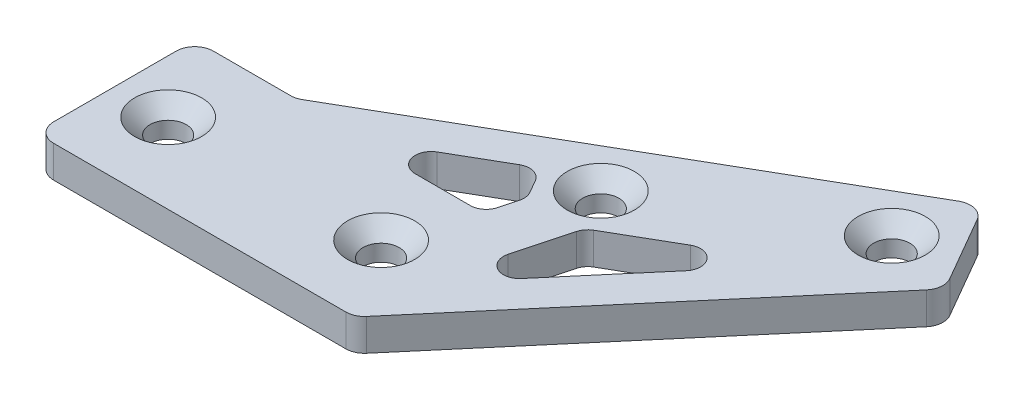
ISO-10303-21;
HEADER;
FILE_DESCRIPTION(('STEP AP214'),'2;1');
FILE_NAME('part.step','',(''),(''),'','','');
FILE_SCHEMA(('AUTOMOTIVE_DESIGN { 1 0 10303 214 1 1 1 1 }'));
ENDSEC;
DATA;
#1=APPLICATION_CONTEXT('core data for automotive mechanical design processes');
#2=APPLICATION_PROTOCOL_DEFINITION('international standard','automotive_design',2000,#1);
#3=PRODUCT_CONTEXT('',#1,'mechanical');
#4=PRODUCT('Part','Part','',(#3));
#5=PRODUCT_RELATED_PRODUCT_CATEGORY('part','',(#4));
#6=PRODUCT_DEFINITION_FORMATION('','',#4);
#7=PRODUCT_DEFINITION_CONTEXT('part definition',#1,'design');
#8=PRODUCT_DEFINITION('design','',#6,#7);
#9=PRODUCT_DEFINITION_SHAPE('','',#8);
#10=(LENGTH_UNIT() NAMED_UNIT(*) SI_UNIT(.MILLI.,.METRE.));
#11=(NAMED_UNIT(*) PLANE_ANGLE_UNIT() SI_UNIT($,.RADIAN.));
#12=(NAMED_UNIT(*) SI_UNIT($,.STERADIAN.) SOLID_ANGLE_UNIT());
#13=UNCERTAINTY_MEASURE_WITH_UNIT(LENGTH_MEASURE(1.E-05),#10,'distance_accuracy_value','');
#14=(GEOMETRIC_REPRESENTATION_CONTEXT(3) GLOBAL_UNCERTAINTY_ASSIGNED_CONTEXT((#13)) GLOBAL_UNIT_ASSIGNED_CONTEXT((#10,
#11,#12)) REPRESENTATION_CONTEXT('',''));
#15=CARTESIAN_POINT('',(0.,0.,0.));
#16=DIRECTION('',(0.,0.,1.));
#17=DIRECTION('',(1.,0.,0.));
#18=AXIS2_PLACEMENT_3D('',#15,#16,#17);
#19=CARTESIAN_POINT('',(0.,1.5,0.));
#20=DIRECTION('',(0.,-1.,0.));
#21=DIRECTION('',(0.,0.,-1.));
#22=AXIS2_PLACEMENT_3D('',#19,#20,#21);
#23=PLANE('',#22);
#24=CARTESIAN_POINT('',(5.,1.5,7.5));
#25=DIRECTION('',(0.,1.,0.));
#26=DIRECTION('',(0.,0.,1.));
#27=AXIS2_PLACEMENT_3D('',#24,#25,#26);
#28=CIRCLE('',#27,3.15);
#29=CARTESIAN_POINT('',(5.,1.5,10.65));
#30=VERTEX_POINT('',#29);
#31=EDGE_CURVE('E506',#30,#30,#28,.T.);
#32=ORIENTED_EDGE('',*,*,#31,.F.);
#33=EDGE_LOOP('',(#32));
#34=FACE_BOUND('',#33,.T.);
#35=CARTESIAN_POINT('',(25.,1.5,7.5));
#36=DIRECTION('',(0.,1.,0.));
#37=DIRECTION('',(0.,0.,1.));
#38=AXIS2_PLACEMENT_3D('',#35,#36,#37);
#39=CIRCLE('',#38,3.15);
#40=CARTESIAN_POINT('',(25.,1.5,10.65));
#41=VERTEX_POINT('',#40);
#42=EDGE_CURVE('E346',#41,#41,#39,.T.);
#43=ORIENTED_EDGE('',*,*,#42,.F.);
#44=EDGE_LOOP('',(#43));
#45=FACE_BOUND('',#44,.T.);
#46=CARTESIAN_POINT('',(31.3001270189222,1.5,-6.83012701892215));
#47=DIRECTION('',(0.,1.,0.));
#48=DIRECTION('',(0.,0.,1.));
#49=AXIS2_PLACEMENT_3D('',#46,#47,#48);
#50=CIRCLE('',#49,3.15);
#51=CARTESIAN_POINT('',(31.3001270189222,1.5,-3.68012701892215));
#52=VERTEX_POINT('',#51);
#53=EDGE_CURVE('E352',#52,#52,#50,.T.);
#54=ORIENTED_EDGE('',*,*,#53,.F.);
#55=EDGE_LOOP('',(#54));
#56=FACE_BOUND('',#55,.T.);
#57=CARTESIAN_POINT('',(48.620635094611,1.5,-16.8301270189222));
#58=DIRECTION('',(0.,1.,0.));
#59=DIRECTION('',(0.,0.,1.));
#60=AXIS2_PLACEMENT_3D('',#57,#58,#59);
#61=CIRCLE('',#60,3.15);
#62=CARTESIAN_POINT('',(48.620635094611,1.5,-13.6801270189222));
#63=VERTEX_POINT('',#62);
#64=EDGE_CURVE('E358',#63,#63,#61,.T.);
#65=ORIENTED_EDGE('',*,*,#64,.F.);
#66=EDGE_LOOP('',(#65));
#67=FACE_BOUND('',#66,.T.);
#68=DIRECTION('',(-0.258819045102521,0.,0.965925826289068));
#69=VECTOR('',#68,1.);
#70=CARTESIAN_POINT('',(30.6351432602032,1.5,8.20866189658321));
#71=LINE('',#70,#69);
#72=CARTESIAN_POINT('',(33.472623995892,1.5,-2.38096037450546));
#73=VERTEX_POINT('',#72);
#74=CARTESIAN_POINT('',(32.1164978136408,1.5,2.68017143913028));
#75=VERTEX_POINT('',#74);
#76=EDGE_CURVE('E293',#73,#75,#71,.T.);
#77=ORIENTED_EDGE('',*,*,#76,.F.);
#78=CARTESIAN_POINT('',(34.9215127353256,1.5,-1.99273180685168));
#79=DIRECTION('',(0.,-1.,0.));
#80=DIRECTION('',(0.,0.,-1.));
#81=AXIS2_PLACEMENT_3D('',#78,#79,#80);
#82=CIRCLE('',#81,1.5);
#83=CARTESIAN_POINT('',(34.1715127353256,1.5,-3.29176991252834));
#84=VERTEX_POINT('',#83);
#85=EDGE_CURVE('E295',#73,#84,#82,.T.);
#86=ORIENTED_EDGE('',*,*,#85,.T.);
#87=DIRECTION('',(0.866025403784438,0.,-0.500000000000001));
#88=VECTOR('',#87,1.);
#89=CARTESIAN_POINT('',(7.11750000000004,1.5,12.3278716228715));
#90=LINE('',#89,#88);
#91=CARTESIAN_POINT('',(39.9291176898745,1.5,-6.61592468292466));
#92=VERTEX_POINT('',#91);
#93=EDGE_CURVE('E289',#84,#92,#90,.T.);
#94=ORIENTED_EDGE('',*,*,#93,.T.);
#95=CARTESIAN_POINT('',(40.6791176898745,1.5,-5.31688657724799));
#96=DIRECTION('',(0.,-1.,0.));
#97=DIRECTION('',(0.,0.,-1.));
#98=AXIS2_PLACEMENT_3D('',#95,#96,#97);
#99=CIRCLE('',#98,1.5);
#100=CARTESIAN_POINT('',(41.8229525524503,1.5,-4.34650427776186));
#101=VERTEX_POINT('',#100);
#102=EDGE_CURVE('E285',#92,#101,#99,.T.);
#103=ORIENTED_EDGE('',*,*,#102,.T.);
#104=DIRECTION('',(0.646921532990766,0.,-0.762556575050584));
#105=VECTOR('',#104,1.);
#106=CARTESIAN_POINT('',(22.175541919768,1.5,18.8128147379565));
#107=LINE('',#106,#105);
#108=CARTESIAN_POINT('',(34.7092214156503,1.5,4.03878230627021));
#109=VERTEX_POINT('',#108);
#110=EDGE_CURVE('E302',#109,#101,#107,.T.);
#111=ORIENTED_EDGE('',*,*,#110,.F.);
#112=CARTESIAN_POINT('',(33.5653865530744,1.5,3.06840000678406));
#113=DIRECTION('',(0.,-1.,0.));
#114=DIRECTION('',(0.,0.,-1.));
#115=AXIS2_PLACEMENT_3D('',#112,#113,#114);
#116=CIRCLE('',#115,1.5);
#117=EDGE_CURVE('E227',#109,#75,#116,.T.);
#118=ORIENTED_EDGE('',*,*,#117,.T.);
#119=EDGE_LOOP('',(#77,#86,#94,#103,#111,#118));
#120=FACE_BOUND('',#119,.T.);
#121=DIRECTION('',(-1.,0.,0.));
#122=VECTOR('',#121,1.);
#123=CARTESIAN_POINT('',(0.,1.5,0.));
#124=LINE('',#123,#122);
#125=CARTESIAN_POINT('',(9.00108891324583,1.5,0.));
#126=VERTEX_POINT('',#125);
#127=CARTESIAN_POINT('',(1.75,1.5,0.));
#128=VERTEX_POINT('',#127);
#129=EDGE_CURVE('E478',#126,#128,#124,.T.);
#130=ORIENTED_EDGE('',*,*,#129,.T.);
#131=CARTESIAN_POINT('',(1.75,1.5,1.75));
#132=DIRECTION('',(0.,-1.,0.));
#133=DIRECTION('',(0.,0.,-1.));
#134=AXIS2_PLACEMENT_3D('',#131,#132,#133);
#135=CIRCLE('',#134,1.75);
#136=CARTESIAN_POINT('',(0.,1.5,1.75));
#137=VERTEX_POINT('',#136);
#138=EDGE_CURVE('E388',#128,#137,#135,.F.);
#139=ORIENTED_EDGE('',*,*,#138,.T.);
#140=DIRECTION('',(0.,0.,1.));
#141=VECTOR('',#140,1.);
#142=CARTESIAN_POINT('',(0.,1.5,15.));
#143=LINE('',#142,#141);
#144=CARTESIAN_POINT('',(0.,1.5,13.25));
#145=VERTEX_POINT('',#144);
#146=EDGE_CURVE('E474',#137,#145,#143,.T.);
#147=ORIENTED_EDGE('',*,*,#146,.T.);
#148=CARTESIAN_POINT('',(1.75,1.5,13.25));
#149=DIRECTION('',(0.,-1.,0.));
#150=DIRECTION('',(0.,0.,-1.));
#151=AXIS2_PLACEMENT_3D('',#148,#149,#150);
#152=CIRCLE('',#151,1.75);
#153=CARTESIAN_POINT('',(1.75000000000001,1.5,15.));
#154=VERTEX_POINT('',#153);
#155=EDGE_CURVE('E392',#145,#154,#152,.F.);
#156=ORIENTED_EDGE('',*,*,#155,.T.);
#157=DIRECTION('',(1.,0.,0.));
#158=VECTOR('',#157,1.);
#159=CARTESIAN_POINT('',(30.,1.5,15.));
#160=LINE('',#159,#158);
#161=CARTESIAN_POINT('',(29.1897160978185,1.5,15.));
#162=VERTEX_POINT('',#161);
#163=EDGE_CURVE('E470',#154,#162,#160,.T.);
#164=ORIENTED_EDGE('',*,*,#163,.T.);
#165=CARTESIAN_POINT('',(29.1897160978185,1.5,13.25));
#166=DIRECTION('',(0.,-1.,0.));
#167=DIRECTION('',(0.,0.,-1.));
#168=AXIS2_PLACEMENT_3D('',#165,#166,#167);
#169=CIRCLE('',#168,1.75);
#170=CARTESIAN_POINT('',(30.524190104157,1.5,14.3821126827338));
#171=VERTEX_POINT('',#170);
#172=EDGE_CURVE('E402',#162,#171,#169,.F.);
#173=ORIENTED_EDGE('',*,*,#172,.T.);
#174=DIRECTION('',(0.646921532990766,0.,-0.762556575050584));
#175=VECTOR('',#174,1.);
#176=CARTESIAN_POINT('',(55.4507621135331,1.5,-15.));
#177=LINE('',#176,#175);
#178=CARTESIAN_POINT('',(54.6534768491289,1.5,-14.0602026836986));
#179=VERTEX_POINT('',#178);
#180=EDGE_CURVE('E466',#171,#179,#177,.T.);
#181=ORIENTED_EDGE('',*,*,#180,.T.);
#182=CARTESIAN_POINT('',(53.3190028427904,1.5,-15.1923153664324));
#183=DIRECTION('',(0.,-1.,0.));
#184=DIRECTION('',(0.,0.,-1.));
#185=AXIS2_PLACEMENT_3D('',#182,#183,#184);
#186=CIRCLE('',#185,1.75);
#187=CARTESIAN_POINT('',(54.8345472994132,1.5,-16.0673153664324));
#188=VERTEX_POINT('',#187);
#189=EDGE_CURVE('E399',#179,#188,#186,.F.);
#190=ORIENTED_EDGE('',*,*,#189,.T.);
#191=DIRECTION('',(-0.500000000000002,0.,-0.866025403784437));
#192=VECTOR('',#191,1.);
#193=CARTESIAN_POINT('',(50.4507621135332,1.5,-23.6602540378443));
#194=LINE('',#193,#192);
#195=CARTESIAN_POINT('',(51.3257621135332,1.5,-22.1447095812216));
#196=VERTEX_POINT('',#195);
#197=EDGE_CURVE('E266',#188,#196,#194,.T.);
#198=ORIENTED_EDGE('',*,*,#197,.T.);
#199=CARTESIAN_POINT('',(49.8102176569104,1.5,-21.2697095812216));
#200=DIRECTION('',(0.,-1.,0.));
#201=DIRECTION('',(0.,0.,-1.));
#202=AXIS2_PLACEMENT_3D('',#199,#200,#201);
#203=CIRCLE('',#202,1.75);
#204=CARTESIAN_POINT('',(48.9352176569104,1.5,-22.7852540378443));
#205=VERTEX_POINT('',#204);
#206=EDGE_CURVE('E396',#196,#205,#203,.F.);
#207=ORIENTED_EDGE('',*,*,#206,.T.);
#208=DIRECTION('',(-0.866025403784437,0.,0.500000000000002));
#209=VECTOR('',#208,1.);
#210=CARTESIAN_POINT('',(24.47,1.5,-8.66025403784428));
#211=LINE('',#210,#209);
#212=CARTESIAN_POINT('',(9.87608891324584,1.5,-0.234455543377227));
#213=VERTEX_POINT('',#212);
#214=EDGE_CURVE('E450',#205,#213,#211,.T.);
#215=ORIENTED_EDGE('',*,*,#214,.T.);
#216=CARTESIAN_POINT('',(9.00108891324583,1.5,-1.75));
#217=DIRECTION('',(0.,-1.,0.));
#218=DIRECTION('',(0.,0.,-1.));
#219=AXIS2_PLACEMENT_3D('',#216,#217,#218);
#220=CIRCLE('',#219,1.75);
#221=EDGE_CURVE('E12',#213,#126,#220,.T.);
#222=ORIENTED_EDGE('',*,*,#221,.T.);
#223=EDGE_LOOP('',(#130,#139,#147,#156,#164,#173,#181,#190,#198,#207,#215,#222));
#224=FACE_BOUND('',#223,.T.);
#225=DIRECTION('',(0.500000000000001,0.,0.866025403784438));
#226=VECTOR('',#225,1.);
#227=CARTESIAN_POINT('',(22.5355127018922,1.5,-13.0108843247637));
#228=LINE('',#227,#226);
#229=CARTESIAN_POINT('',(27.4030127018923,1.5,-4.58012701892208));
#230=VERTEX_POINT('',#229);
#231=CARTESIAN_POINT('',(28.1049156630359,1.5,-3.36439542823822));
#232=VERTEX_POINT('',#231);
#233=EDGE_CURVE('E200',#230,#232,#228,.T.);
#234=ORIENTED_EDGE('',*,*,#233,.T.);
#235=CARTESIAN_POINT('',(26.8058775573593,1.5,-2.61439542823822));
#236=DIRECTION('',(0.,-1.,0.));
#237=DIRECTION('',(0.,0.,-1.));
#238=AXIS2_PLACEMENT_3D('',#235,#236,#237);
#239=CIRCLE('',#238,1.5);
#240=CARTESIAN_POINT('',(28.2547662967929,1.5,-2.22616686058444));
#241=VERTEX_POINT('',#240);
#242=EDGE_CURVE('E216',#232,#241,#239,.T.);
#243=ORIENTED_EDGE('',*,*,#242,.T.);
#244=DIRECTION('',(-0.258819045102522,0.,0.965925826289068));
#245=VECTOR('',#244,1.);
#246=CARTESIAN_POINT('',(25.8055141287578,1.5,6.91456667107061));
#247=LINE('',#246,#245);
#248=CARTESIAN_POINT('',(27.8221903455319,1.5,-0.611771432346216));
#249=VERTEX_POINT('',#248);
#250=EDGE_CURVE('E207',#241,#249,#247,.T.);
#251=ORIENTED_EDGE('',*,*,#250,.T.);
#252=CARTESIAN_POINT('',(26.3733016060983,1.5,-1.));
#253=DIRECTION('',(0.,-1.,0.));
#254=DIRECTION('',(0.,0.,-1.));
#255=AXIS2_PLACEMENT_3D('',#252,#253,#254);
#256=CIRCLE('',#255,1.5);
#257=CARTESIAN_POINT('',(26.3733016060983,1.5,0.5));
#258=VERTEX_POINT('',#257);
#259=EDGE_CURVE('E160',#249,#258,#256,.T.);
#260=ORIENTED_EDGE('',*,*,#259,.T.);
#261=DIRECTION('',(1.,0.,0.));
#262=VECTOR('',#261,1.);
#263=CARTESIAN_POINT('',(0.,1.5,0.5));
#264=LINE('',#263,#262);
#265=CARTESIAN_POINT('',(21.2020508075691,1.5,0.5));
#266=VERTEX_POINT('',#265);
#267=EDGE_CURVE('E54',#266,#258,#264,.T.);
#268=ORIENTED_EDGE('',*,*,#267,.F.);
#269=CARTESIAN_POINT('',(21.2020508075691,1.5,-1.));
#270=DIRECTION('',(0.,-1.,0.));
#271=DIRECTION('',(0.,0.,-1.));
#272=AXIS2_PLACEMENT_3D('',#269,#270,#271);
#273=CIRCLE('',#272,1.5);
#274=CARTESIAN_POINT('',(20.4520508075692,1.5,-2.29903810567666));
#275=VERTEX_POINT('',#274);
#276=EDGE_CURVE('E166',#266,#275,#273,.T.);
#277=ORIENTED_EDGE('',*,*,#276,.T.);
#278=DIRECTION('',(-0.866025403784438,0.,0.500000000000002));
#279=VECTOR('',#278,1.);
#280=CARTESIAN_POINT('',(4.1175000000001,1.5,7.13171920016499));
#281=LINE('',#280,#279);
#282=CARTESIAN_POINT('',(25.3539745962156,1.5,-5.12916512459875));
#283=VERTEX_POINT('',#282);
#284=EDGE_CURVE('E191',#283,#275,#281,.T.);
#285=ORIENTED_EDGE('',*,*,#284,.F.);
#286=CARTESIAN_POINT('',(26.1039745962156,1.5,-3.83012701892209));
#287=DIRECTION('',(0.,-1.,0.));
#288=DIRECTION('',(0.,0.,-1.));
#289=AXIS2_PLACEMENT_3D('',#286,#287,#288);
#290=CIRCLE('',#289,1.5);
#291=EDGE_CURVE('E211',#283,#230,#290,.T.);
#292=ORIENTED_EDGE('',*,*,#291,.T.);
#293=EDGE_LOOP('',(#234,#243,#251,#260,#268,#277,#285,#292));
#294=FACE_BOUND('',#293,.T.);
#295=ADVANCED_FACE('F50',(#34,#45,#56,#67,#120,#224,#294),#23,.F.);
#296=CARTESIAN_POINT('',(0.,-1.5,0.));
#297=DIRECTION('',(0.,-1.,0.));
#298=DIRECTION('',(0.,0.,-1.));
#299=AXIS2_PLACEMENT_3D('',#296,#297,#298);
#300=PLANE('',#299);
#301=CARTESIAN_POINT('',(5.,-1.5,7.5));
#302=DIRECTION('',(0.,-1.,0.));
#303=DIRECTION('',(0.,0.,-1.));
#304=AXIS2_PLACEMENT_3D('',#301,#302,#303);
#305=CIRCLE('',#304,1.7);
#306=CARTESIAN_POINT('',(5.,-1.5,5.8));
#307=VERTEX_POINT('',#306);
#308=EDGE_CURVE('E342',#307,#307,#305,.T.);
#309=ORIENTED_EDGE('',*,*,#308,.F.);
#310=EDGE_LOOP('',(#309));
#311=FACE_BOUND('',#310,.T.);
#312=CARTESIAN_POINT('',(25.,-1.5,7.5));
#313=DIRECTION('',(0.,-1.,0.));
#314=DIRECTION('',(0.,0.,-1.));
#315=AXIS2_PLACEMENT_3D('',#312,#313,#314);
#316=CIRCLE('',#315,1.7);
#317=CARTESIAN_POINT('',(25.,-1.5,5.8));
#318=VERTEX_POINT('',#317);
#319=EDGE_CURVE('E348',#318,#318,#316,.T.);
#320=ORIENTED_EDGE('',*,*,#319,.F.);
#321=EDGE_LOOP('',(#320));
#322=FACE_BOUND('',#321,.T.);
#323=CARTESIAN_POINT('',(31.3001270189222,-1.5,-6.83012701892215));
#324=DIRECTION('',(0.,-1.,0.));
#325=DIRECTION('',(0.,0.,-1.));
#326=AXIS2_PLACEMENT_3D('',#323,#324,#325);
#327=CIRCLE('',#326,1.7);
#328=CARTESIAN_POINT('',(31.3001270189222,-1.5,-8.53012701892214));
#329=VERTEX_POINT('',#328);
#330=EDGE_CURVE('E354',#329,#329,#327,.T.);
#331=ORIENTED_EDGE('',*,*,#330,.F.);
#332=EDGE_LOOP('',(#331));
#333=FACE_BOUND('',#332,.T.);
#334=CARTESIAN_POINT('',(48.620635094611,-1.5,-16.8301270189222));
#335=DIRECTION('',(0.,-1.,0.));
#336=DIRECTION('',(0.,0.,-1.));
#337=AXIS2_PLACEMENT_3D('',#334,#335,#336);
#338=CIRCLE('',#337,1.7);
#339=CARTESIAN_POINT('',(48.620635094611,-1.5,-18.5301270189222));
#340=VERTEX_POINT('',#339);
#341=EDGE_CURVE('E294',#340,#340,#338,.T.);
#342=ORIENTED_EDGE('',*,*,#341,.F.);
#343=EDGE_LOOP('',(#342));
#344=FACE_BOUND('',#343,.T.);
#345=DIRECTION('',(0.,0.,1.));
#346=VECTOR('',#345,1.);
#347=CARTESIAN_POINT('',(0.,-1.5,15.));
#348=LINE('',#347,#346);
#349=CARTESIAN_POINT('',(0.,-1.5,1.75));
#350=VERTEX_POINT('',#349);
#351=CARTESIAN_POINT('',(0.,-1.5,13.25));
#352=VERTEX_POINT('',#351);
#353=EDGE_CURVE('E457',#350,#352,#348,.T.);
#354=ORIENTED_EDGE('',*,*,#353,.F.);
#355=CARTESIAN_POINT('',(1.75,-1.5,1.75));
#356=DIRECTION('',(0.,-1.,0.));
#357=DIRECTION('',(0.,0.,-1.));
#358=AXIS2_PLACEMENT_3D('',#355,#356,#357);
#359=CIRCLE('',#358,1.75);
#360=CARTESIAN_POINT('',(1.75,-1.5,0.));
#361=VERTEX_POINT('',#360);
#362=EDGE_CURVE('E406',#350,#361,#359,.T.);
#363=ORIENTED_EDGE('',*,*,#362,.T.);
#364=DIRECTION('',(-1.,0.,0.));
#365=VECTOR('',#364,1.);
#366=CARTESIAN_POINT('',(0.,-1.5,0.));
#367=LINE('',#366,#365);
#368=CARTESIAN_POINT('',(9.00108891324583,-1.5,0.));
#369=VERTEX_POINT('',#368);
#370=EDGE_CURVE('E260',#369,#361,#367,.T.);
#371=ORIENTED_EDGE('',*,*,#370,.F.);
#372=CARTESIAN_POINT('',(9.00108891324583,-1.5,-1.75));
#373=DIRECTION('',(0.,-1.,0.));
#374=DIRECTION('',(0.,0.,-1.));
#375=AXIS2_PLACEMENT_3D('',#372,#373,#374);
#376=CIRCLE('',#375,1.75);
#377=CARTESIAN_POINT('',(9.87608891324584,-1.5,-0.234455543377237));
#378=VERTEX_POINT('',#377);
#379=EDGE_CURVE('E61',#369,#378,#376,.F.);
#380=ORIENTED_EDGE('',*,*,#379,.T.);
#381=DIRECTION('',(-0.866025403784438,0.,0.500000000000001));
#382=VECTOR('',#381,1.);
#383=CARTESIAN_POINT('',(24.47,-1.5,-8.66025403784428));
#384=LINE('',#383,#382);
#385=CARTESIAN_POINT('',(48.9352176569104,-1.5,-22.7852540378443));
#386=VERTEX_POINT('',#385);
#387=EDGE_CURVE('E252',#386,#378,#384,.T.);
#388=ORIENTED_EDGE('',*,*,#387,.F.);
#389=CARTESIAN_POINT('',(49.8102176569104,-1.5,-21.2697095812216));
#390=DIRECTION('',(0.,-1.,0.));
#391=DIRECTION('',(0.,0.,-1.));
#392=AXIS2_PLACEMENT_3D('',#389,#390,#391);
#393=CIRCLE('',#392,1.75);
#394=CARTESIAN_POINT('',(51.3257621135332,-1.5,-22.1447095812216));
#395=VERTEX_POINT('',#394);
#396=EDGE_CURVE('E413',#386,#395,#393,.T.);
#397=ORIENTED_EDGE('',*,*,#396,.T.);
#398=DIRECTION('',(-0.500000000000002,0.,-0.866025403784437));
#399=VECTOR('',#398,1.);
#400=CARTESIAN_POINT('',(50.4507621135332,-1.5,-23.6602540378443));
#401=LINE('',#400,#399);
#402=CARTESIAN_POINT('',(54.8345472994132,-1.5,-16.0673153664324));
#403=VERTEX_POINT('',#402);
#404=EDGE_CURVE('E447',#403,#395,#401,.T.);
#405=ORIENTED_EDGE('',*,*,#404,.F.);
#406=CARTESIAN_POINT('',(53.3190028427904,-1.5,-15.1923153664324));
#407=DIRECTION('',(0.,-1.,0.));
#408=DIRECTION('',(0.,0.,-1.));
#409=AXIS2_PLACEMENT_3D('',#406,#407,#408);
#410=CIRCLE('',#409,1.75);
#411=CARTESIAN_POINT('',(54.6534768491289,-1.5,-14.0602026836986));
#412=VERTEX_POINT('',#411);
#413=EDGE_CURVE('E417',#403,#412,#410,.T.);
#414=ORIENTED_EDGE('',*,*,#413,.T.);
#415=DIRECTION('',(0.646921532990766,0.,-0.762556575050584));
#416=VECTOR('',#415,1.);
#417=CARTESIAN_POINT('',(55.4507621135331,-1.5,-15.));
#418=LINE('',#417,#416);
#419=CARTESIAN_POINT('',(30.524190104157,-1.5,14.3821126827338));
#420=VERTEX_POINT('',#419);
#421=EDGE_CURVE('E451',#420,#412,#418,.T.);
#422=ORIENTED_EDGE('',*,*,#421,.F.);
#423=CARTESIAN_POINT('',(29.1897160978185,-1.5,13.25));
#424=DIRECTION('',(0.,-1.,0.));
#425=DIRECTION('',(0.,0.,-1.));
#426=AXIS2_PLACEMENT_3D('',#423,#424,#425);
#427=CIRCLE('',#426,1.75);
#428=CARTESIAN_POINT('',(29.1897160978185,-1.5,15.));
#429=VERTEX_POINT('',#428);
#430=EDGE_CURVE('E421',#420,#429,#427,.T.);
#431=ORIENTED_EDGE('',*,*,#430,.T.);
#432=DIRECTION('',(1.,0.,0.));
#433=VECTOR('',#432,1.);
#434=CARTESIAN_POINT('',(30.,-1.5,15.));
#435=LINE('',#434,#433);
#436=CARTESIAN_POINT('',(1.75000000000001,-1.5,15.));
#437=VERTEX_POINT('',#436);
#438=EDGE_CURVE('E454',#437,#429,#435,.T.);
#439=ORIENTED_EDGE('',*,*,#438,.F.);
#440=CARTESIAN_POINT('',(1.75,-1.5,13.25));
#441=DIRECTION('',(0.,-1.,0.));
#442=DIRECTION('',(0.,0.,-1.));
#443=AXIS2_PLACEMENT_3D('',#440,#441,#442);
#444=CIRCLE('',#443,1.75);
#445=EDGE_CURVE('E409',#437,#352,#444,.T.);
#446=ORIENTED_EDGE('',*,*,#445,.T.);
#447=EDGE_LOOP('',(#354,#363,#371,#380,#388,#397,#405,#414,#422,#431,#439,#446));
#448=FACE_BOUND('',#447,.T.);
#449=DIRECTION('',(-0.258819045102521,0.,0.965925826289068));
#450=VECTOR('',#449,1.);
#451=CARTESIAN_POINT('',(30.6351432602032,-1.5,8.20866189658321));
#452=LINE('',#451,#450);
#453=CARTESIAN_POINT('',(33.472623995892,-1.5,-2.38096037450546));
#454=VERTEX_POINT('',#453);
#455=CARTESIAN_POINT('',(32.1164978136408,-1.5,2.68017143913028));
#456=VERTEX_POINT('',#455);
#457=EDGE_CURVE('E311',#454,#456,#452,.T.);
#458=ORIENTED_EDGE('',*,*,#457,.T.);
#459=CARTESIAN_POINT('',(33.5653865530744,-1.5,3.06840000678406));
#460=DIRECTION('',(0.,-1.,0.));
#461=DIRECTION('',(0.,0.,-1.));
#462=AXIS2_PLACEMENT_3D('',#459,#460,#461);
#463=CIRCLE('',#462,1.5);
#464=CARTESIAN_POINT('',(34.7092214156503,-1.5,4.03878230627021));
#465=VERTEX_POINT('',#464);
#466=EDGE_CURVE('E298',#456,#465,#463,.F.);
#467=ORIENTED_EDGE('',*,*,#466,.T.);
#468=DIRECTION('',(0.646921532990766,0.,-0.762556575050584));
#469=VECTOR('',#468,1.);
#470=CARTESIAN_POINT('',(22.175541919768,-1.5,18.8128147379565));
#471=LINE('',#470,#469);
#472=CARTESIAN_POINT('',(41.8229525524503,-1.5,-4.34650427776186));
#473=VERTEX_POINT('',#472);
#474=EDGE_CURVE('E221',#465,#473,#471,.T.);
#475=ORIENTED_EDGE('',*,*,#474,.T.);
#476=CARTESIAN_POINT('',(40.6791176898745,-1.5,-5.31688657724799));
#477=DIRECTION('',(0.,-1.,0.));
#478=DIRECTION('',(0.,0.,-1.));
#479=AXIS2_PLACEMENT_3D('',#476,#477,#478);
#480=CIRCLE('',#479,1.5);
#481=CARTESIAN_POINT('',(39.9291176898745,-1.5,-6.61592468292466));
#482=VERTEX_POINT('',#481);
#483=EDGE_CURVE('E214',#473,#482,#480,.F.);
#484=ORIENTED_EDGE('',*,*,#483,.T.);
#485=DIRECTION('',(0.866025403784438,0.,-0.500000000000001));
#486=VECTOR('',#485,1.);
#487=CARTESIAN_POINT('',(7.11750000000004,-1.5,12.3278716228715));
#488=LINE('',#487,#486);
#489=CARTESIAN_POINT('',(34.1715127353256,-1.5,-3.29176991252834));
#490=VERTEX_POINT('',#489);
#491=EDGE_CURVE('E308',#490,#482,#488,.T.);
#492=ORIENTED_EDGE('',*,*,#491,.F.);
#493=CARTESIAN_POINT('',(34.9215127353256,-1.5,-1.99273180685168));
#494=DIRECTION('',(0.,-1.,0.));
#495=DIRECTION('',(0.,0.,-1.));
#496=AXIS2_PLACEMENT_3D('',#493,#494,#495);
#497=CIRCLE('',#496,1.5);
#498=EDGE_CURVE('E288',#490,#454,#497,.F.);
#499=ORIENTED_EDGE('',*,*,#498,.T.);
#500=EDGE_LOOP('',(#458,#467,#475,#484,#492,#499));
#501=FACE_BOUND('',#500,.T.);
#502=DIRECTION('',(-0.866025403784438,0.,0.500000000000002));
#503=VECTOR('',#502,1.);
#504=CARTESIAN_POINT('',(4.1175000000001,-1.5,7.13171920016499));
#505=LINE('',#504,#503);
#506=CARTESIAN_POINT('',(25.3539745962156,-1.5,-5.12916512459875));
#507=VERTEX_POINT('',#506);
#508=CARTESIAN_POINT('',(20.4520508075692,-1.5,-2.29903810567666));
#509=VERTEX_POINT('',#508);
#510=EDGE_CURVE('E242',#507,#509,#505,.T.);
#511=ORIENTED_EDGE('',*,*,#510,.T.);
#512=CARTESIAN_POINT('',(21.2020508075691,-1.5,-1.));
#513=DIRECTION('',(0.,-1.,0.));
#514=DIRECTION('',(0.,0.,-1.));
#515=AXIS2_PLACEMENT_3D('',#512,#513,#514);
#516=CIRCLE('',#515,1.5);
#517=CARTESIAN_POINT('',(21.2020508075691,-1.5,0.5));
#518=VERTEX_POINT('',#517);
#519=EDGE_CURVE('E175',#509,#518,#516,.F.);
#520=ORIENTED_EDGE('',*,*,#519,.T.);
#521=DIRECTION('',(1.,0.,0.));
#522=VECTOR('',#521,1.);
#523=CARTESIAN_POINT('',(0.,-1.5,0.5));
#524=LINE('',#523,#522);
#525=CARTESIAN_POINT('',(26.3733016060983,-1.5,0.5));
#526=VERTEX_POINT('',#525);
#527=EDGE_CURVE('E183',#518,#526,#524,.T.);
#528=ORIENTED_EDGE('',*,*,#527,.T.);
#529=CARTESIAN_POINT('',(26.3733016060983,-1.5,-1.));
#530=DIRECTION('',(0.,-1.,0.));
#531=DIRECTION('',(0.,0.,-1.));
#532=AXIS2_PLACEMENT_3D('',#529,#530,#531);
#533=CIRCLE('',#532,1.5);
#534=CARTESIAN_POINT('',(27.822190345532,-1.5,-0.611771432346216));
#535=VERTEX_POINT('',#534);
#536=EDGE_CURVE('E223',#526,#535,#533,.F.);
#537=ORIENTED_EDGE('',*,*,#536,.T.);
#538=DIRECTION('',(-0.258819045102522,0.,0.965925826289068));
#539=VECTOR('',#538,1.);
#540=CARTESIAN_POINT('',(25.8055141287578,-1.5,6.91456667107061));
#541=LINE('',#540,#539);
#542=CARTESIAN_POINT('',(28.2547662967929,-1.5,-2.22616686058444));
#543=VERTEX_POINT('',#542);
#544=EDGE_CURVE('E190',#543,#535,#541,.T.);
#545=ORIENTED_EDGE('',*,*,#544,.F.);
#546=CARTESIAN_POINT('',(26.8058775573593,-1.5,-2.61439542823822));
#547=DIRECTION('',(0.,-1.,0.));
#548=DIRECTION('',(0.,0.,-1.));
#549=AXIS2_PLACEMENT_3D('',#546,#547,#548);
#550=CIRCLE('',#549,1.5);
#551=CARTESIAN_POINT('',(28.1049156630359,-1.5,-3.36439542823822));
#552=VERTEX_POINT('',#551);
#553=EDGE_CURVE('E219',#543,#552,#550,.F.);
#554=ORIENTED_EDGE('',*,*,#553,.T.);
#555=DIRECTION('',(0.500000000000001,0.,0.866025403784438));
#556=VECTOR('',#555,1.);
#557=CARTESIAN_POINT('',(22.5355127018922,-1.5,-13.0108843247637));
#558=LINE('',#557,#556);
#559=CARTESIAN_POINT('',(27.4030127018923,-1.5,-4.58012701892208));
#560=VERTEX_POINT('',#559);
#561=EDGE_CURVE('E197',#560,#552,#558,.T.);
#562=ORIENTED_EDGE('',*,*,#561,.F.);
#563=CARTESIAN_POINT('',(26.1039745962156,-1.5,-3.83012701892209));
#564=DIRECTION('',(0.,-1.,0.));
#565=DIRECTION('',(0.,0.,-1.));
#566=AXIS2_PLACEMENT_3D('',#563,#564,#565);
#567=CIRCLE('',#566,1.5);
#568=EDGE_CURVE('E213',#560,#507,#567,.F.);
#569=ORIENTED_EDGE('',*,*,#568,.T.);
#570=EDGE_LOOP('',(#511,#520,#528,#537,#545,#554,#562,#569));
#571=FACE_BOUND('',#570,.T.);
#572=ADVANCED_FACE('F516',(#311,#322,#333,#344,#448,#501,#571),#300,.T.);
#573=CARTESIAN_POINT('',(24.47,1.5,-8.66025403784428));
#574=DIRECTION('',(0.500000000000002,0.,0.866025403784438));
#575=DIRECTION('',(0.866025403784438,0.,-0.500000000000002));
#576=AXIS2_PLACEMENT_3D('',#573,#574,#575);
#577=PLANE('',#576);
#578=ORIENTED_EDGE('',*,*,#387,.T.);
#579=DIRECTION('',(0.,-1.,0.));
#580=VECTOR('',#579,1.);
#581=CARTESIAN_POINT('',(9.87608891324584,1.5,-0.234455543377234));
#582=LINE('',#581,#580);
#583=EDGE_CURVE('E432',#378,#213,#582,.F.);
#584=ORIENTED_EDGE('',*,*,#583,.T.);
#585=ORIENTED_EDGE('',*,*,#214,.F.);
#586=DIRECTION('',(0.,-1.,0.));
#587=VECTOR('',#586,1.);
#588=CARTESIAN_POINT('',(48.9352176569104,1.5,-22.7852540378443));
#589=LINE('',#588,#587);
#590=EDGE_CURVE('E436',#205,#386,#589,.T.);
#591=ORIENTED_EDGE('',*,*,#590,.T.);
#592=EDGE_LOOP('',(#578,#584,#585,#591));
#593=FACE_BOUND('',#592,.T.);
#594=ADVANCED_FACE('F611',(#593),#577,.F.);
#595=CARTESIAN_POINT('',(0.,1.5,0.));
#596=DIRECTION('',(0.,0.,1.));
#597=DIRECTION('',(1.,0.,0.));
#598=AXIS2_PLACEMENT_3D('',#595,#596,#597);
#599=PLANE('',#598);
#600=ORIENTED_EDGE('',*,*,#129,.F.);
#601=DIRECTION('',(0.,-1.,0.));
#602=VECTOR('',#601,1.);
#603=CARTESIAN_POINT('',(9.00108891324583,-1.5,0.));
#604=LINE('',#603,#602);
#605=EDGE_CURVE('E440',#126,#369,#604,.T.);
#606=ORIENTED_EDGE('',*,*,#605,.T.);
#607=ORIENTED_EDGE('',*,*,#370,.T.);
#608=DIRECTION('',(0.,-1.,0.));
#609=VECTOR('',#608,1.);
#610=CARTESIAN_POINT('',(1.75,1.5,0.));
#611=LINE('',#610,#609);
#612=EDGE_CURVE('E244',#361,#128,#611,.F.);
#613=ORIENTED_EDGE('',*,*,#612,.T.);
#614=EDGE_LOOP('',(#600,#606,#607,#613));
#615=FACE_BOUND('',#614,.T.);
#616=ADVANCED_FACE('F619',(#615),#599,.F.);
#617=CARTESIAN_POINT('',(0.,1.5,15.));
#618=DIRECTION('',(1.,0.,0.));
#619=DIRECTION('',(0.,0.,-1.));
#620=AXIS2_PLACEMENT_3D('',#617,#618,#619);
#621=PLANE('',#620);
#622=ORIENTED_EDGE('',*,*,#146,.F.);
#623=DIRECTION('',(0.,-1.,0.));
#624=VECTOR('',#623,1.);
#625=CARTESIAN_POINT('',(0.,1.5,1.75));
#626=LINE('',#625,#624);
#627=EDGE_CURVE('E424',#137,#350,#626,.T.);
#628=ORIENTED_EDGE('',*,*,#627,.T.);
#629=ORIENTED_EDGE('',*,*,#353,.T.);
#630=DIRECTION('',(0.,-1.,0.));
#631=VECTOR('',#630,1.);
#632=CARTESIAN_POINT('',(0.,1.5,13.25));
#633=LINE('',#632,#631);
#634=EDGE_CURVE('E428',#352,#145,#633,.F.);
#635=ORIENTED_EDGE('',*,*,#634,.T.);
#636=EDGE_LOOP('',(#622,#628,#629,#635));
#637=FACE_BOUND('',#636,.T.);
#638=ADVANCED_FACE('F549',(#637),#621,.F.);
#639=CARTESIAN_POINT('',(30.,1.5,15.));
#640=DIRECTION('',(0.,0.,-1.));
#641=DIRECTION('',(-1.,0.,0.));
#642=AXIS2_PLACEMENT_3D('',#639,#640,#641);
#643=PLANE('',#642);
#644=ORIENTED_EDGE('',*,*,#163,.F.);
#645=DIRECTION('',(0.,-1.,0.));
#646=VECTOR('',#645,1.);
#647=CARTESIAN_POINT('',(1.75,1.5,15.));
#648=LINE('',#647,#646);
#649=EDGE_CURVE('E380',#154,#437,#648,.T.);
#650=ORIENTED_EDGE('',*,*,#649,.T.);
#651=ORIENTED_EDGE('',*,*,#438,.T.);
#652=DIRECTION('',(0.,-1.,0.));
#653=VECTOR('',#652,1.);
#654=CARTESIAN_POINT('',(29.1897160978185,1.5,15.));
#655=LINE('',#654,#653);
#656=EDGE_CURVE('E384',#429,#162,#655,.F.);
#657=ORIENTED_EDGE('',*,*,#656,.T.);
#658=EDGE_LOOP('',(#644,#650,#651,#657));
#659=FACE_BOUND('',#658,.T.);
#660=ADVANCED_FACE('F570',(#659),#643,.F.);
#661=CARTESIAN_POINT('',(55.4507621135331,1.5,-15.));
#662=DIRECTION('',(-0.762556575050584,0.,-0.646921532990766));
#663=DIRECTION('',(-0.646921532990766,0.,0.762556575050584));
#664=AXIS2_PLACEMENT_3D('',#661,#662,#663);
#665=PLANE('',#664);
#666=ORIENTED_EDGE('',*,*,#421,.T.);
#667=DIRECTION('',(0.,-1.,0.));
#668=VECTOR('',#667,1.);
#669=CARTESIAN_POINT('',(54.6534768491289,1.5,-14.0602026836986));
#670=LINE('',#669,#668);
#671=EDGE_CURVE('E367',#412,#179,#670,.F.);
#672=ORIENTED_EDGE('',*,*,#671,.T.);
#673=ORIENTED_EDGE('',*,*,#180,.F.);
#674=DIRECTION('',(0.,-1.,0.));
#675=VECTOR('',#674,1.);
#676=CARTESIAN_POINT('',(30.524190104157,1.5,14.3821126827338));
#677=LINE('',#676,#675);
#678=EDGE_CURVE('E371',#171,#420,#677,.T.);
#679=ORIENTED_EDGE('',*,*,#678,.T.);
#680=EDGE_LOOP('',(#666,#672,#673,#679));
#681=FACE_BOUND('',#680,.T.);
#682=ADVANCED_FACE('F586',(#681),#665,.F.);
#683=CARTESIAN_POINT('',(50.4507621135332,1.5,-23.6602540378443));
#684=DIRECTION('',(-0.866025403784437,0.,0.500000000000002));
#685=DIRECTION('',(0.500000000000002,0.,0.866025403784437));
#686=AXIS2_PLACEMENT_3D('',#683,#684,#685);
#687=PLANE('',#686);
#688=ORIENTED_EDGE('',*,*,#404,.T.);
#689=DIRECTION('',(0.,-1.,0.));
#690=VECTOR('',#689,1.);
#691=CARTESIAN_POINT('',(51.3257621135332,1.5,-22.1447095812216));
#692=LINE('',#691,#690);
#693=EDGE_CURVE('E70',#395,#196,#692,.F.);
#694=ORIENTED_EDGE('',*,*,#693,.T.);
#695=ORIENTED_EDGE('',*,*,#197,.F.);
#696=DIRECTION('',(0.,-1.,0.));
#697=VECTOR('',#696,1.);
#698=CARTESIAN_POINT('',(54.8345472994132,1.5,-16.0673153664324));
#699=LINE('',#698,#697);
#700=EDGE_CURVE('E376',#188,#403,#699,.T.);
#701=ORIENTED_EDGE('',*,*,#700,.T.);
#702=EDGE_LOOP('',(#688,#694,#695,#701));
#703=FACE_BOUND('',#702,.T.);
#704=ADVANCED_FACE('F599',(#703),#687,.F.);
#705=CARTESIAN_POINT('',(7.11750000000004,-1.5,12.3278716228715));
#706=DIRECTION('',(0.500000000000001,0.,0.866025403784438));
#707=DIRECTION('',(0.866025403784438,0.,-0.500000000000001));
#708=AXIS2_PLACEMENT_3D('',#705,#706,#707);
#709=PLANE('',#708);
#710=ORIENTED_EDGE('',*,*,#93,.F.);
#711=DIRECTION('',(0.,1.,0.));
#712=VECTOR('',#711,1.);
#713=CARTESIAN_POINT('',(34.1715127353256,-1.5,-3.29176991252834));
#714=LINE('',#713,#712);
#715=EDGE_CURVE('E176',#84,#490,#714,.F.);
#716=ORIENTED_EDGE('',*,*,#715,.T.);
#717=ORIENTED_EDGE('',*,*,#491,.T.);
#718=DIRECTION('',(0.,1.,0.));
#719=VECTOR('',#718,1.);
#720=CARTESIAN_POINT('',(39.9291176898745,-1.5,-6.61592468292466));
#721=LINE('',#720,#719);
#722=EDGE_CURVE('E323',#482,#92,#721,.T.);
#723=ORIENTED_EDGE('',*,*,#722,.T.);
#724=EDGE_LOOP('',(#710,#716,#717,#723));
#725=FACE_BOUND('',#724,.T.);
#726=ADVANCED_FACE('F652',(#725),#709,.T.);
#727=CARTESIAN_POINT('',(22.175541919768,-1.5,18.8128147379565));
#728=DIRECTION('',(0.762556575050584,0.,0.646921532990766));
#729=DIRECTION('',(0.646921532990766,0.,-0.762556575050584));
#730=AXIS2_PLACEMENT_3D('',#727,#728,#729);
#731=PLANE('',#730);
#732=ORIENTED_EDGE('',*,*,#474,.F.);
#733=DIRECTION('',(0.,1.,0.));
#734=VECTOR('',#733,1.);
#735=CARTESIAN_POINT('',(34.7092214156503,-1.5,4.03878230627021));
#736=LINE('',#735,#734);
#737=EDGE_CURVE('E334',#465,#109,#736,.T.);
#738=ORIENTED_EDGE('',*,*,#737,.T.);
#739=ORIENTED_EDGE('',*,*,#110,.T.);
#740=DIRECTION('',(0.,1.,0.));
#741=VECTOR('',#740,1.);
#742=CARTESIAN_POINT('',(41.8229525524503,-1.5,-4.34650427776186));
#743=LINE('',#742,#741);
#744=EDGE_CURVE('E275',#101,#473,#743,.F.);
#745=ORIENTED_EDGE('',*,*,#744,.T.);
#746=EDGE_LOOP('',(#732,#738,#739,#745));
#747=FACE_BOUND('',#746,.T.);
#748=ADVANCED_FACE('F648',(#747),#731,.F.);
#749=CARTESIAN_POINT('',(30.6351432602032,-1.5,8.20866189658321));
#750=DIRECTION('',(-0.965925826289068,0.,-0.258819045102521));
#751=DIRECTION('',(-0.258819045102521,0.,0.965925826289068));
#752=AXIS2_PLACEMENT_3D('',#749,#750,#751);
#753=PLANE('',#752);
#754=ORIENTED_EDGE('',*,*,#76,.T.);
#755=DIRECTION('',(0.,1.,0.));
#756=VECTOR('',#755,1.);
#757=CARTESIAN_POINT('',(32.1164978136408,-1.5,2.68017143913028));
#758=LINE('',#757,#756);
#759=EDGE_CURVE('E327',#75,#456,#758,.F.);
#760=ORIENTED_EDGE('',*,*,#759,.T.);
#761=ORIENTED_EDGE('',*,*,#457,.F.);
#762=DIRECTION('',(0.,1.,0.));
#763=VECTOR('',#762,1.);
#764=CARTESIAN_POINT('',(33.472623995892,-1.5,-2.38096037450546));
#765=LINE('',#764,#763);
#766=EDGE_CURVE('E330',#454,#73,#765,.T.);
#767=ORIENTED_EDGE('',*,*,#766,.T.);
#768=EDGE_LOOP('',(#754,#760,#761,#767));
#769=FACE_BOUND('',#768,.T.);
#770=ADVANCED_FACE('F651',(#769),#753,.F.);
#771=CARTESIAN_POINT('',(25.8055141287578,-1.5,6.91456667107061));
#772=DIRECTION('',(-0.965925826289068,0.,-0.258819045102522));
#773=DIRECTION('',(-0.258819045102522,0.,0.965925826289068));
#774=AXIS2_PLACEMENT_3D('',#771,#772,#773);
#775=PLANE('',#774);
#776=ORIENTED_EDGE('',*,*,#250,.F.);
#777=DIRECTION('',(0.,1.,0.));
#778=VECTOR('',#777,1.);
#779=CARTESIAN_POINT('',(28.2547662967929,-1.5,-2.22616686058444));
#780=LINE('',#779,#778);
#781=EDGE_CURVE('E271',#241,#543,#780,.F.);
#782=ORIENTED_EDGE('',*,*,#781,.T.);
#783=ORIENTED_EDGE('',*,*,#544,.T.);
#784=DIRECTION('',(0.,1.,0.));
#785=VECTOR('',#784,1.);
#786=CARTESIAN_POINT('',(27.822190345532,-1.5,-0.611771432346216));
#787=LINE('',#786,#785);
#788=EDGE_CURVE('E267',#535,#249,#787,.T.);
#789=ORIENTED_EDGE('',*,*,#788,.T.);
#790=EDGE_LOOP('',(#776,#782,#783,#789));
#791=FACE_BOUND('',#790,.T.);
#792=ADVANCED_FACE('F662',(#791),#775,.T.);
#793=CARTESIAN_POINT('',(0.,-1.5,0.5));
#794=DIRECTION('',(0.,0.,1.));
#795=DIRECTION('',(1.,0.,0.));
#796=AXIS2_PLACEMENT_3D('',#793,#794,#795);
#797=PLANE('',#796);
#798=ORIENTED_EDGE('',*,*,#527,.F.);
#799=DIRECTION('',(0.,1.,0.));
#800=VECTOR('',#799,1.);
#801=CARTESIAN_POINT('',(21.2020508075691,-1.5,0.5));
#802=LINE('',#801,#800);
#803=EDGE_CURVE('E170',#518,#266,#802,.T.);
#804=ORIENTED_EDGE('',*,*,#803,.T.);
#805=ORIENTED_EDGE('',*,*,#267,.T.);
#806=DIRECTION('',(0.,1.,0.));
#807=VECTOR('',#806,1.);
#808=CARTESIAN_POINT('',(26.3733016060983,-1.5,0.5));
#809=LINE('',#808,#807);
#810=EDGE_CURVE('E186',#258,#526,#809,.F.);
#811=ORIENTED_EDGE('',*,*,#810,.T.);
#812=EDGE_LOOP('',(#798,#804,#805,#811));
#813=FACE_BOUND('',#812,.T.);
#814=ADVANCED_FACE('F180',(#813),#797,.F.);
#815=CARTESIAN_POINT('',(4.1175000000001,-1.5,7.13171920016499));
#816=DIRECTION('',(-0.500000000000002,0.,-0.866025403784438));
#817=DIRECTION('',(-0.866025403784438,0.,0.500000000000002));
#818=AXIS2_PLACEMENT_3D('',#815,#816,#817);
#819=PLANE('',#818);
#820=ORIENTED_EDGE('',*,*,#284,.T.);
#821=DIRECTION('',(0.,1.,0.));
#822=VECTOR('',#821,1.);
#823=CARTESIAN_POINT('',(20.4520508075692,-1.5,-2.29903810567666));
#824=LINE('',#823,#822);
#825=EDGE_CURVE('E171',#275,#509,#824,.F.);
#826=ORIENTED_EDGE('',*,*,#825,.T.);
#827=ORIENTED_EDGE('',*,*,#510,.F.);
#828=DIRECTION('',(0.,1.,0.));
#829=VECTOR('',#828,1.);
#830=CARTESIAN_POINT('',(25.3539745962156,-1.5,-5.12916512459875));
#831=LINE('',#830,#829);
#832=EDGE_CURVE('E185',#507,#283,#831,.T.);
#833=ORIENTED_EDGE('',*,*,#832,.T.);
#834=EDGE_LOOP('',(#820,#826,#827,#833));
#835=FACE_BOUND('',#834,.T.);
#836=ADVANCED_FACE('F678',(#835),#819,.F.);
#837=CARTESIAN_POINT('',(22.5355127018922,-1.5,-13.0108843247637));
#838=DIRECTION('',(-0.866025403784438,0.,0.500000000000001));
#839=DIRECTION('',(0.500000000000001,0.,0.866025403784438));
#840=AXIS2_PLACEMENT_3D('',#837,#838,#839);
#841=PLANE('',#840);
#842=ORIENTED_EDGE('',*,*,#561,.T.);
#843=DIRECTION('',(0.,1.,0.));
#844=VECTOR('',#843,1.);
#845=CARTESIAN_POINT('',(28.1049156630359,-1.5,-3.36439542823822));
#846=LINE('',#845,#844);
#847=EDGE_CURVE('E272',#552,#232,#846,.T.);
#848=ORIENTED_EDGE('',*,*,#847,.T.);
#849=ORIENTED_EDGE('',*,*,#233,.F.);
#850=DIRECTION('',(0.,1.,0.));
#851=VECTOR('',#850,1.);
#852=CARTESIAN_POINT('',(27.4030127018923,-1.5,-4.58012701892208));
#853=LINE('',#852,#851);
#854=EDGE_CURVE('E278',#230,#560,#853,.F.);
#855=ORIENTED_EDGE('',*,*,#854,.T.);
#856=EDGE_LOOP('',(#842,#848,#849,#855));
#857=FACE_BOUND('',#856,.T.);
#858=ADVANCED_FACE('F677',(#857),#841,.T.);
#859=CARTESIAN_POINT('',(21.2020508075691,-1.5,-1.));
#860=DIRECTION('',(0.,-1.,0.));
#861=DIRECTION('',(0.,0.,-1.));
#862=AXIS2_PLACEMENT_3D('',#859,#860,#861);
#863=CYLINDRICAL_SURFACE('',#862,1.5);
#864=ORIENTED_EDGE('',*,*,#519,.F.);
#865=ORIENTED_EDGE('',*,*,#825,.F.);
#866=ORIENTED_EDGE('',*,*,#276,.F.);
#867=ORIENTED_EDGE('',*,*,#803,.F.);
#868=EDGE_LOOP('',(#864,#865,#866,#867));
#869=FACE_BOUND('',#868,.T.);
#870=ADVANCED_FACE('F169',(#869),#863,.F.);
#871=CARTESIAN_POINT('',(26.8058775573593,-1.5,-2.61439542823822));
#872=DIRECTION('',(0.,-1.,0.));
#873=DIRECTION('',(0.,0.,-1.));
#874=AXIS2_PLACEMENT_3D('',#871,#872,#873);
#875=CYLINDRICAL_SURFACE('',#874,1.5);
#876=ORIENTED_EDGE('',*,*,#553,.F.);
#877=ORIENTED_EDGE('',*,*,#781,.F.);
#878=ORIENTED_EDGE('',*,*,#242,.F.);
#879=ORIENTED_EDGE('',*,*,#847,.F.);
#880=EDGE_LOOP('',(#876,#877,#878,#879));
#881=FACE_BOUND('',#880,.T.);
#882=ADVANCED_FACE('F676',(#881),#875,.F.);
#883=CARTESIAN_POINT('',(26.3733016060983,-1.5,-1.));
#884=DIRECTION('',(0.,1.,0.));
#885=DIRECTION('',(0.,0.,1.));
#886=AXIS2_PLACEMENT_3D('',#883,#884,#885);
#887=CYLINDRICAL_SURFACE('',#886,1.5);
#888=ORIENTED_EDGE('',*,*,#536,.F.);
#889=ORIENTED_EDGE('',*,*,#810,.F.);
#890=ORIENTED_EDGE('',*,*,#259,.F.);
#891=ORIENTED_EDGE('',*,*,#788,.F.);
#892=EDGE_LOOP('',(#888,#889,#890,#891));
#893=FACE_BOUND('',#892,.T.);
#894=ADVANCED_FACE('F658',(#893),#887,.F.);
#895=CARTESIAN_POINT('',(33.5653865530744,-1.5,3.06840000678406));
#896=DIRECTION('',(0.,-1.,0.));
#897=DIRECTION('',(0.,0.,-1.));
#898=AXIS2_PLACEMENT_3D('',#895,#896,#897);
#899=CYLINDRICAL_SURFACE('',#898,1.5);
#900=ORIENTED_EDGE('',*,*,#466,.F.);
#901=ORIENTED_EDGE('',*,*,#759,.F.);
#902=ORIENTED_EDGE('',*,*,#117,.F.);
#903=ORIENTED_EDGE('',*,*,#737,.F.);
#904=EDGE_LOOP('',(#900,#901,#902,#903));
#905=FACE_BOUND('',#904,.T.);
#906=ADVANCED_FACE('F654',(#905),#899,.F.);
#907=CARTESIAN_POINT('',(34.9215127353256,-1.5,-1.99273180685168));
#908=DIRECTION('',(0.,1.,0.));
#909=DIRECTION('',(0.,0.,1.));
#910=AXIS2_PLACEMENT_3D('',#907,#908,#909);
#911=CYLINDRICAL_SURFACE('',#910,1.5);
#912=ORIENTED_EDGE('',*,*,#498,.F.);
#913=ORIENTED_EDGE('',*,*,#715,.F.);
#914=ORIENTED_EDGE('',*,*,#85,.F.);
#915=ORIENTED_EDGE('',*,*,#766,.F.);
#916=EDGE_LOOP('',(#912,#913,#914,#915));
#917=FACE_BOUND('',#916,.T.);
#918=ADVANCED_FACE('F657',(#917),#911,.F.);
#919=CARTESIAN_POINT('',(40.6791176898745,-1.5,-5.31688657724799));
#920=DIRECTION('',(0.,1.,0.));
#921=DIRECTION('',(0.,0.,1.));
#922=AXIS2_PLACEMENT_3D('',#919,#920,#921);
#923=CYLINDRICAL_SURFACE('',#922,1.5);
#924=ORIENTED_EDGE('',*,*,#483,.F.);
#925=ORIENTED_EDGE('',*,*,#744,.F.);
#926=ORIENTED_EDGE('',*,*,#102,.F.);
#927=ORIENTED_EDGE('',*,*,#722,.F.);
#928=EDGE_LOOP('',(#924,#925,#926,#927));
#929=FACE_BOUND('',#928,.T.);
#930=ADVANCED_FACE('F666',(#929),#923,.F.);
#931=CARTESIAN_POINT('',(26.1039745962156,-1.5,-3.83012701892209));
#932=DIRECTION('',(0.,1.,0.));
#933=DIRECTION('',(0.,0.,1.));
#934=AXIS2_PLACEMENT_3D('',#931,#932,#933);
#935=CYLINDRICAL_SURFACE('',#934,1.5);
#936=ORIENTED_EDGE('',*,*,#568,.F.);
#937=ORIENTED_EDGE('',*,*,#854,.F.);
#938=ORIENTED_EDGE('',*,*,#291,.F.);
#939=ORIENTED_EDGE('',*,*,#832,.F.);
#940=EDGE_LOOP('',(#936,#937,#938,#939));
#941=FACE_BOUND('',#940,.T.);
#942=ADVANCED_FACE('F52',(#941),#935,.F.);
#943=CARTESIAN_POINT('',(9.00108891324583,1.5,-1.75));
#944=DIRECTION('',(0.,1.,0.));
#945=DIRECTION('',(0.,0.,1.));
#946=AXIS2_PLACEMENT_3D('',#943,#944,#945);
#947=CYLINDRICAL_SURFACE('',#946,1.75);
#948=ORIENTED_EDGE('',*,*,#221,.F.);
#949=ORIENTED_EDGE('',*,*,#583,.F.);
#950=ORIENTED_EDGE('',*,*,#379,.F.);
#951=ORIENTED_EDGE('',*,*,#605,.F.);
#952=EDGE_LOOP('',(#948,#949,#950,#951));
#953=FACE_BOUND('',#952,.T.);
#954=ADVANCED_FACE('F617',(#953),#947,.F.);
#955=CARTESIAN_POINT('',(1.75,1.5,1.75));
#956=DIRECTION('',(0.,-1.,0.));
#957=DIRECTION('',(0.,0.,-1.));
#958=AXIS2_PLACEMENT_3D('',#955,#956,#957);
#959=CYLINDRICAL_SURFACE('',#958,1.75);
#960=ORIENTED_EDGE('',*,*,#138,.F.);
#961=ORIENTED_EDGE('',*,*,#612,.F.);
#962=ORIENTED_EDGE('',*,*,#362,.F.);
#963=ORIENTED_EDGE('',*,*,#627,.F.);
#964=EDGE_LOOP('',(#960,#961,#962,#963));
#965=FACE_BOUND('',#964,.T.);
#966=ADVANCED_FACE('F540',(#965),#959,.T.);
#967=CARTESIAN_POINT('',(1.75,1.5,13.25));
#968=DIRECTION('',(0.,-1.,0.));
#969=DIRECTION('',(0.,0.,-1.));
#970=AXIS2_PLACEMENT_3D('',#967,#968,#969);
#971=CYLINDRICAL_SURFACE('',#970,1.75);
#972=ORIENTED_EDGE('',*,*,#155,.F.);
#973=ORIENTED_EDGE('',*,*,#634,.F.);
#974=ORIENTED_EDGE('',*,*,#445,.F.);
#975=ORIENTED_EDGE('',*,*,#649,.F.);
#976=EDGE_LOOP('',(#972,#973,#974,#975));
#977=FACE_BOUND('',#976,.T.);
#978=ADVANCED_FACE('F563',(#977),#971,.T.);
#979=CARTESIAN_POINT('',(49.8102176569104,1.5,-21.2697095812216));
#980=DIRECTION('',(0.,-1.,0.));
#981=DIRECTION('',(0.,0.,-1.));
#982=AXIS2_PLACEMENT_3D('',#979,#980,#981);
#983=CYLINDRICAL_SURFACE('',#982,1.75);
#984=ORIENTED_EDGE('',*,*,#206,.F.);
#985=ORIENTED_EDGE('',*,*,#693,.F.);
#986=ORIENTED_EDGE('',*,*,#396,.F.);
#987=ORIENTED_EDGE('',*,*,#590,.F.);
#988=EDGE_LOOP('',(#984,#985,#986,#987));
#989=FACE_BOUND('',#988,.T.);
#990=ADVANCED_FACE('F605',(#989),#983,.T.);
#991=CARTESIAN_POINT('',(53.3190028427904,1.5,-15.1923153664324));
#992=DIRECTION('',(0.,-1.,0.));
#993=DIRECTION('',(0.,0.,-1.));
#994=AXIS2_PLACEMENT_3D('',#991,#992,#993);
#995=CYLINDRICAL_SURFACE('',#994,1.75);
#996=ORIENTED_EDGE('',*,*,#189,.F.);
#997=ORIENTED_EDGE('',*,*,#671,.F.);
#998=ORIENTED_EDGE('',*,*,#413,.F.);
#999=ORIENTED_EDGE('',*,*,#700,.F.);
#1000=EDGE_LOOP('',(#996,#997,#998,#999));
#1001=FACE_BOUND('',#1000,.T.);
#1002=ADVANCED_FACE('F597',(#1001),#995,.T.);
#1003=CARTESIAN_POINT('',(29.1897160978185,1.5,13.25));
#1004=DIRECTION('',(0.,-1.,0.));
#1005=DIRECTION('',(0.,0.,-1.));
#1006=AXIS2_PLACEMENT_3D('',#1003,#1004,#1005);
#1007=CYLINDRICAL_SURFACE('',#1006,1.75);
#1008=ORIENTED_EDGE('',*,*,#172,.F.);
#1009=ORIENTED_EDGE('',*,*,#656,.F.);
#1010=ORIENTED_EDGE('',*,*,#430,.F.);
#1011=ORIENTED_EDGE('',*,*,#678,.F.);
#1012=EDGE_LOOP('',(#1008,#1009,#1010,#1011));
#1013=FACE_BOUND('',#1012,.T.);
#1014=ADVANCED_FACE('F580',(#1013),#1007,.T.);
#1015=CARTESIAN_POINT('',(48.620635094611,1.5,-16.8301270189222));
#1016=DIRECTION('',(0.,1.,0.));
#1017=DIRECTION('',(0.,0.,1.));
#1018=AXIS2_PLACEMENT_3D('',#1015,#1016,#1017);
#1019=CYLINDRICAL_SURFACE('',#1018,1.7);
#1020=ORIENTED_EDGE('',*,*,#341,.T.);
#1021=EDGE_LOOP('',(#1020));
#1022=FACE_BOUND('',#1021,.T.);
#1023=CARTESIAN_POINT('',(48.620635094611,0.0500000000000001,-16.8301270189222));
#1024=DIRECTION('',(0.,1.,0.));
#1025=DIRECTION('',(0.,0.,1.));
#1026=AXIS2_PLACEMENT_3D('',#1023,#1024,#1025);
#1027=CIRCLE('',#1026,1.7);
#1028=CARTESIAN_POINT('',(48.620635094611,0.0500000000000001,-15.1301270189222));
#1029=VERTEX_POINT('',#1028);
#1030=EDGE_CURVE('E362',#1029,#1029,#1027,.T.);
#1031=ORIENTED_EDGE('',*,*,#1030,.T.);
#1032=EDGE_LOOP('',(#1031));
#1033=FACE_BOUND('',#1032,.T.);
#1034=ADVANCED_FACE('F647',(#1022,#1033),#1019,.F.);
#1035=CARTESIAN_POINT('',(48.620635094611,1.5,-16.8301270189222));
#1036=DIRECTION('',(0.,1.,0.));
#1037=DIRECTION('',(0.,0.,1.));
#1038=AXIS2_PLACEMENT_3D('',#1035,#1036,#1037);
#1039=CONICAL_SURFACE('',#1038,3.15,0.785398163397448);
#1040=ORIENTED_EDGE('',*,*,#1030,.F.);
#1041=EDGE_LOOP('',(#1040));
#1042=FACE_BOUND('',#1041,.T.);
#1043=ORIENTED_EDGE('',*,*,#64,.T.);
#1044=EDGE_LOOP('',(#1043));
#1045=FACE_BOUND('',#1044,.T.);
#1046=ADVANCED_FACE('F805',(#1042,#1045),#1039,.F.);
#1047=CARTESIAN_POINT('',(31.3001270189222,1.5,-6.83012701892215));
#1048=DIRECTION('',(0.,1.,0.));
#1049=DIRECTION('',(0.,0.,1.));
#1050=AXIS2_PLACEMENT_3D('',#1047,#1048,#1049);
#1051=CYLINDRICAL_SURFACE('',#1050,1.7);
#1052=ORIENTED_EDGE('',*,*,#330,.T.);
#1053=EDGE_LOOP('',(#1052));
#1054=FACE_BOUND('',#1053,.T.);
#1055=CARTESIAN_POINT('',(31.3001270189222,0.0500000000000001,-6.83012701892215));
#1056=DIRECTION('',(0.,1.,0.));
#1057=DIRECTION('',(0.,0.,1.));
#1058=AXIS2_PLACEMENT_3D('',#1055,#1056,#1057);
#1059=CIRCLE('',#1058,1.7);
#1060=CARTESIAN_POINT('',(31.3001270189222,0.0500000000000001,-5.13012701892215));
#1061=VERTEX_POINT('',#1060);
#1062=EDGE_CURVE('E359',#1061,#1061,#1059,.T.);
#1063=ORIENTED_EDGE('',*,*,#1062,.T.);
#1064=EDGE_LOOP('',(#1063));
#1065=FACE_BOUND('',#1064,.T.);
#1066=ADVANCED_FACE('F811',(#1054,#1065),#1051,.F.);
#1067=CARTESIAN_POINT('',(31.3001270189222,1.5,-6.83012701892215));
#1068=DIRECTION('',(0.,1.,0.));
#1069=DIRECTION('',(0.,0.,1.));
#1070=AXIS2_PLACEMENT_3D('',#1067,#1068,#1069);
#1071=CONICAL_SURFACE('',#1070,3.15,0.785398163397448);
#1072=ORIENTED_EDGE('',*,*,#1062,.F.);
#1073=EDGE_LOOP('',(#1072));
#1074=FACE_BOUND('',#1073,.T.);
#1075=ORIENTED_EDGE('',*,*,#53,.T.);
#1076=EDGE_LOOP('',(#1075));
#1077=FACE_BOUND('',#1076,.T.);
#1078=ADVANCED_FACE('F818',(#1074,#1077),#1071,.F.);
#1079=CARTESIAN_POINT('',(25.,1.5,7.5));
#1080=DIRECTION('',(0.,1.,0.));
#1081=DIRECTION('',(0.,0.,1.));
#1082=AXIS2_PLACEMENT_3D('',#1079,#1080,#1081);
#1083=CYLINDRICAL_SURFACE('',#1082,1.7);
#1084=ORIENTED_EDGE('',*,*,#319,.T.);
#1085=EDGE_LOOP('',(#1084));
#1086=FACE_BOUND('',#1085,.T.);
#1087=CARTESIAN_POINT('',(25.,0.0500000000000001,7.5));
#1088=DIRECTION('',(0.,1.,0.));
#1089=DIRECTION('',(0.,0.,1.));
#1090=AXIS2_PLACEMENT_3D('',#1087,#1088,#1089);
#1091=CIRCLE('',#1090,1.7);
#1092=CARTESIAN_POINT('',(25.,0.0500000000000001,9.2));
#1093=VERTEX_POINT('',#1092);
#1094=EDGE_CURVE('E353',#1093,#1093,#1091,.T.);
#1095=ORIENTED_EDGE('',*,*,#1094,.T.);
#1096=EDGE_LOOP('',(#1095));
#1097=FACE_BOUND('',#1096,.T.);
#1098=ADVANCED_FACE('F825',(#1086,#1097),#1083,.F.);
#1099=CARTESIAN_POINT('',(25.,1.5,7.5));
#1100=DIRECTION('',(0.,1.,0.));
#1101=DIRECTION('',(0.,0.,1.));
#1102=AXIS2_PLACEMENT_3D('',#1099,#1100,#1101);
#1103=CONICAL_SURFACE('',#1102,3.15,0.78539816339745);
#1104=ORIENTED_EDGE('',*,*,#1094,.F.);
#1105=EDGE_LOOP('',(#1104));
#1106=FACE_BOUND('',#1105,.T.);
#1107=ORIENTED_EDGE('',*,*,#42,.T.);
#1108=EDGE_LOOP('',(#1107));
#1109=FACE_BOUND('',#1108,.T.);
#1110=ADVANCED_FACE('F832',(#1106,#1109),#1103,.F.);
#1111=CARTESIAN_POINT('',(5.,1.5,7.5));
#1112=DIRECTION('',(0.,1.,0.));
#1113=DIRECTION('',(0.,0.,1.));
#1114=AXIS2_PLACEMENT_3D('',#1111,#1112,#1113);
#1115=CYLINDRICAL_SURFACE('',#1114,1.7);
#1116=ORIENTED_EDGE('',*,*,#308,.T.);
#1117=EDGE_LOOP('',(#1116));
#1118=FACE_BOUND('',#1117,.T.);
#1119=CARTESIAN_POINT('',(5.,0.0500000000000001,7.5));
#1120=DIRECTION('',(0.,1.,0.));
#1121=DIRECTION('',(0.,0.,1.));
#1122=AXIS2_PLACEMENT_3D('',#1119,#1120,#1121);
#1123=CIRCLE('',#1122,1.7);
#1124=CARTESIAN_POINT('',(5.,0.0500000000000001,9.2));
#1125=VERTEX_POINT('',#1124);
#1126=EDGE_CURVE('E347',#1125,#1125,#1123,.T.);
#1127=ORIENTED_EDGE('',*,*,#1126,.T.);
#1128=EDGE_LOOP('',(#1127));
#1129=FACE_BOUND('',#1128,.T.);
#1130=ADVANCED_FACE('F839',(#1118,#1129),#1115,.F.);
#1131=CARTESIAN_POINT('',(5.,1.5,7.5));
#1132=DIRECTION('',(0.,1.,0.));
#1133=DIRECTION('',(0.,0.,1.));
#1134=AXIS2_PLACEMENT_3D('',#1131,#1132,#1133);
#1135=CONICAL_SURFACE('',#1134,3.15,0.78539816339745);
#1136=ORIENTED_EDGE('',*,*,#1126,.F.);
#1137=EDGE_LOOP('',(#1136));
#1138=FACE_BOUND('',#1137,.T.);
#1139=ORIENTED_EDGE('',*,*,#31,.T.);
#1140=EDGE_LOOP('',(#1139));
#1141=FACE_BOUND('',#1140,.T.);
#1142=ADVANCED_FACE('F512',(#1138,#1141),#1135,.F.);
#1143=CLOSED_SHELL('',(#295,#572,#594,#616,#638,#660,#682,#704,#726,#748,#770,#792,#814,#836,
#858,#870,#882,#894,#906,#918,#930,#942,#954,#966,#978,#990,#1002,#1014,#1034,#1046,#1066,#1078,
#1098,#1110,#1130,#1142));
#1144=MANIFOLD_SOLID_BREP('B2',#1143);
#1145=ADVANCED_BREP_SHAPE_REPRESENTATION('',(#18,#1144),#14);
#1146=SHAPE_DEFINITION_REPRESENTATION(#9,#1145);
ENDSEC;
END-ISO-10303-21;
